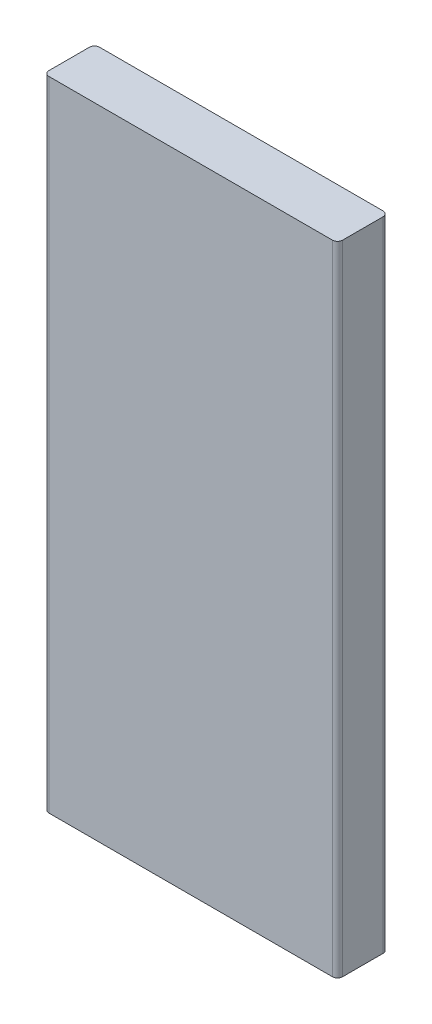
ISO-10303-21;
HEADER;
FILE_DESCRIPTION(('STEP AP214'),'2;1');
FILE_NAME('part.step','',(''),(''),'','','');
FILE_SCHEMA(('AUTOMOTIVE_DESIGN { 1 0 10303 214 1 1 1 1 }'));
ENDSEC;
DATA;
#1=APPLICATION_CONTEXT('core data for automotive mechanical design processes');
#2=APPLICATION_PROTOCOL_DEFINITION('international standard','automotive_design',2000,#1);
#3=PRODUCT_CONTEXT('',#1,'mechanical');
#4=PRODUCT('Part','Part','',(#3));
#5=PRODUCT_RELATED_PRODUCT_CATEGORY('part','',(#4));
#6=PRODUCT_DEFINITION_FORMATION('','',#4);
#7=PRODUCT_DEFINITION_CONTEXT('part definition',#1,'design');
#8=PRODUCT_DEFINITION('design','',#6,#7);
#9=PRODUCT_DEFINITION_SHAPE('','',#8);
#10=(LENGTH_UNIT() NAMED_UNIT(*) SI_UNIT(.MILLI.,.METRE.));
#11=(NAMED_UNIT(*) PLANE_ANGLE_UNIT() SI_UNIT($,.RADIAN.));
#12=(NAMED_UNIT(*) SI_UNIT($,.STERADIAN.) SOLID_ANGLE_UNIT());
#13=UNCERTAINTY_MEASURE_WITH_UNIT(LENGTH_MEASURE(1.E-05),#10,'distance_accuracy_value','');
#14=(GEOMETRIC_REPRESENTATION_CONTEXT(3) GLOBAL_UNCERTAINTY_ASSIGNED_CONTEXT((#13)) GLOBAL_UNIT_ASSIGNED_CONTEXT((#10,
#11,#12)) REPRESENTATION_CONTEXT('',''));
#15=CARTESIAN_POINT('',(0.,0.,0.));
#16=DIRECTION('',(0.,0.,1.));
#17=DIRECTION('',(1.,0.,0.));
#18=AXIS2_PLACEMENT_3D('',#15,#16,#17);
#19=CARTESIAN_POINT('',(-1.4,3.15,0.55));
#20=DIRECTION('',(0.,1.,0.));
#21=DIRECTION('',(1.,0.,0.));
#22=AXIS2_PLACEMENT_3D('',#19,#20,#21);
#23=CYLINDRICAL_SURFACE('',#22,0.05);
#24=CARTESIAN_POINT('',(-1.4,-3.15,0.55));
#25=DIRECTION('',(0.,1.,0.));
#26=DIRECTION('',(1.,0.,0.));
#27=AXIS2_PLACEMENT_3D('',#24,#25,#26);
#28=CIRCLE('',#27,0.05);
#29=CARTESIAN_POINT('',(-1.45,-3.15,0.55));
#30=VERTEX_POINT('',#29);
#31=CARTESIAN_POINT('',(-1.4,-3.15,0.6));
#32=VERTEX_POINT('',#31);
#33=EDGE_CURVE('E11',#30,#32,#28,.T.);
#34=ORIENTED_EDGE('',*,*,#33,.T.);
#35=DIRECTION('',(0.,-1.,0.));
#36=VECTOR('',#35,1.);
#37=CARTESIAN_POINT('',(-1.4,3.15,0.6));
#38=LINE('',#37,#36);
#39=CARTESIAN_POINT('',(-1.4,3.15,0.6));
#40=VERTEX_POINT('',#39);
#41=EDGE_CURVE('E24',#40,#32,#38,.T.);
#42=ORIENTED_EDGE('',*,*,#41,.F.);
#43=CARTESIAN_POINT('',(-1.4,3.15,0.55));
#44=DIRECTION('',(0.,-1.,0.));
#45=DIRECTION('',(1.,0.,0.));
#46=AXIS2_PLACEMENT_3D('',#43,#44,#45);
#47=CIRCLE('',#46,0.05);
#48=CARTESIAN_POINT('',(-1.45,3.15,0.55));
#49=VERTEX_POINT('',#48);
#50=EDGE_CURVE('E137',#40,#49,#47,.T.);
#51=ORIENTED_EDGE('',*,*,#50,.T.);
#52=DIRECTION('',(0.,-1.,0.));
#53=VECTOR('',#52,1.);
#54=CARTESIAN_POINT('',(-1.45,3.15,0.55));
#55=LINE('',#54,#53);
#56=EDGE_CURVE('E135',#49,#30,#55,.T.);
#57=ORIENTED_EDGE('',*,*,#56,.T.);
#58=EDGE_LOOP('',(#34,#42,#51,#57));
#59=FACE_BOUND('',#58,.T.);
#60=ADVANCED_FACE('F17',(#59),#23,.T.);
#61=CARTESIAN_POINT('',(-1.45,3.15,0.15));
#62=DIRECTION('',(-1.,0.,0.));
#63=DIRECTION('',(0.,0.,1.));
#64=AXIS2_PLACEMENT_3D('',#61,#62,#63);
#65=PLANE('',#64);
#66=DIRECTION('',(0.,0.,1.));
#67=VECTOR('',#66,1.);
#68=CARTESIAN_POINT('',(-1.45,-3.15,0.075));
#69=LINE('',#68,#67);
#70=CARTESIAN_POINT('',(-1.45,-3.15,0.15));
#71=VERTEX_POINT('',#70);
#72=EDGE_CURVE('E132',#71,#30,#69,.T.);
#73=ORIENTED_EDGE('',*,*,#72,.T.);
#74=ORIENTED_EDGE('',*,*,#56,.F.);
#75=DIRECTION('',(0.,0.,-1.));
#76=VECTOR('',#75,1.);
#77=CARTESIAN_POINT('',(-1.45,3.15,0.075));
#78=LINE('',#77,#76);
#79=CARTESIAN_POINT('',(-1.45,3.15,0.15));
#80=VERTEX_POINT('',#79);
#81=EDGE_CURVE('E130',#49,#80,#78,.T.);
#82=ORIENTED_EDGE('',*,*,#81,.T.);
#83=DIRECTION('',(0.,-1.,0.));
#84=VECTOR('',#83,1.);
#85=CARTESIAN_POINT('',(-1.45,3.15,0.15));
#86=LINE('',#85,#84);
#87=EDGE_CURVE('E127',#80,#71,#86,.T.);
#88=ORIENTED_EDGE('',*,*,#87,.T.);
#89=EDGE_LOOP('',(#73,#74,#82,#88));
#90=FACE_BOUND('',#89,.T.);
#91=ADVANCED_FACE('F143',(#90),#65,.T.);
#92=CARTESIAN_POINT('',(-1.4,3.15,0.15));
#93=DIRECTION('',(0.,1.,0.));
#94=DIRECTION('',(0.,0.,1.));
#95=AXIS2_PLACEMENT_3D('',#92,#93,#94);
#96=CYLINDRICAL_SURFACE('',#95,0.05);
#97=CARTESIAN_POINT('',(-1.4,-3.15,0.15));
#98=DIRECTION('',(0.,1.,0.));
#99=DIRECTION('',(0.,0.,1.));
#100=AXIS2_PLACEMENT_3D('',#97,#98,#99);
#101=CIRCLE('',#100,0.05);
#102=CARTESIAN_POINT('',(-1.4,-3.15,0.1));
#103=VERTEX_POINT('',#102);
#104=EDGE_CURVE('E124',#103,#71,#101,.T.);
#105=ORIENTED_EDGE('',*,*,#104,.T.);
#106=ORIENTED_EDGE('',*,*,#87,.F.);
#107=CARTESIAN_POINT('',(-1.4,3.15,0.15));
#108=DIRECTION('',(0.,-1.,0.));
#109=DIRECTION('',(0.,0.,1.));
#110=AXIS2_PLACEMENT_3D('',#107,#108,#109);
#111=CIRCLE('',#110,0.05);
#112=CARTESIAN_POINT('',(-1.4,3.15,0.1));
#113=VERTEX_POINT('',#112);
#114=EDGE_CURVE('E122',#80,#113,#111,.T.);
#115=ORIENTED_EDGE('',*,*,#114,.T.);
#116=DIRECTION('',(0.,-1.,0.));
#117=VECTOR('',#116,1.);
#118=CARTESIAN_POINT('',(-1.4,3.15,0.1));
#119=LINE('',#118,#117);
#120=EDGE_CURVE('E119',#113,#103,#119,.T.);
#121=ORIENTED_EDGE('',*,*,#120,.T.);
#122=EDGE_LOOP('',(#105,#106,#115,#121));
#123=FACE_BOUND('',#122,.T.);
#124=ADVANCED_FACE('F151',(#123),#96,.T.);
#125=CARTESIAN_POINT('',(1.4,3.15,0.15));
#126=DIRECTION('',(0.,1.,0.));
#127=DIRECTION('',(-1.,0.,0.));
#128=AXIS2_PLACEMENT_3D('',#125,#126,#127);
#129=CYLINDRICAL_SURFACE('',#128,0.0499999999999997);
#130=CARTESIAN_POINT('',(1.4,3.15,0.15));
#131=DIRECTION('',(0.,-1.,0.));
#132=DIRECTION('',(-1.,0.,0.));
#133=AXIS2_PLACEMENT_3D('',#130,#131,#132);
#134=CIRCLE('',#133,0.0499999999999997);
#135=CARTESIAN_POINT('',(1.4,3.15,0.1));
#136=VERTEX_POINT('',#135);
#137=CARTESIAN_POINT('',(1.45,3.15,0.15));
#138=VERTEX_POINT('',#137);
#139=EDGE_CURVE('E117',#136,#138,#134,.T.);
#140=ORIENTED_EDGE('',*,*,#139,.T.);
#141=DIRECTION('',(0.,-1.,0.));
#142=VECTOR('',#141,1.);
#143=CARTESIAN_POINT('',(1.45,3.15,0.15));
#144=LINE('',#143,#142);
#145=CARTESIAN_POINT('',(1.45,-3.15,0.15));
#146=VERTEX_POINT('',#145);
#147=EDGE_CURVE('E115',#138,#146,#144,.T.);
#148=ORIENTED_EDGE('',*,*,#147,.T.);
#149=CARTESIAN_POINT('',(1.4,-3.15,0.15));
#150=DIRECTION('',(0.,1.,0.));
#151=DIRECTION('',(-1.,0.,0.));
#152=AXIS2_PLACEMENT_3D('',#149,#150,#151);
#153=CIRCLE('',#152,0.0499999999999997);
#154=CARTESIAN_POINT('',(1.4,-3.15,0.1));
#155=VERTEX_POINT('',#154);
#156=EDGE_CURVE('E113',#146,#155,#153,.T.);
#157=ORIENTED_EDGE('',*,*,#156,.T.);
#158=DIRECTION('',(0.,-1.,0.));
#159=VECTOR('',#158,1.);
#160=CARTESIAN_POINT('',(1.4,3.15,0.1));
#161=LINE('',#160,#159);
#162=EDGE_CURVE('E110',#136,#155,#161,.T.);
#163=ORIENTED_EDGE('',*,*,#162,.F.);
#164=EDGE_LOOP('',(#140,#148,#157,#163));
#165=FACE_BOUND('',#164,.T.);
#166=ADVANCED_FACE('F163',(#165),#129,.T.);
#167=CARTESIAN_POINT('',(1.45,3.15,0.55));
#168=DIRECTION('',(1.,0.,0.));
#169=DIRECTION('',(0.,0.,-1.));
#170=AXIS2_PLACEMENT_3D('',#167,#168,#169);
#171=PLANE('',#170);
#172=DIRECTION('',(0.,0.,1.));
#173=VECTOR('',#172,1.);
#174=CARTESIAN_POINT('',(1.45,3.15,0.275));
#175=LINE('',#174,#173);
#176=CARTESIAN_POINT('',(1.45,3.15,0.55));
#177=VERTEX_POINT('',#176);
#178=EDGE_CURVE('E108',#138,#177,#175,.T.);
#179=ORIENTED_EDGE('',*,*,#178,.T.);
#180=DIRECTION('',(0.,-1.,0.));
#181=VECTOR('',#180,1.);
#182=CARTESIAN_POINT('',(1.45,3.15,0.55));
#183=LINE('',#182,#181);
#184=CARTESIAN_POINT('',(1.45,-3.15,0.55));
#185=VERTEX_POINT('',#184);
#186=EDGE_CURVE('E106',#177,#185,#183,.T.);
#187=ORIENTED_EDGE('',*,*,#186,.T.);
#188=DIRECTION('',(0.,0.,-1.));
#189=VECTOR('',#188,1.);
#190=CARTESIAN_POINT('',(1.45,-3.15,0.275));
#191=LINE('',#190,#189);
#192=EDGE_CURVE('E94',#185,#146,#191,.T.);
#193=ORIENTED_EDGE('',*,*,#192,.T.);
#194=ORIENTED_EDGE('',*,*,#147,.F.);
#195=EDGE_LOOP('',(#179,#187,#193,#194));
#196=FACE_BOUND('',#195,.T.);
#197=ADVANCED_FACE('F159',(#196),#171,.T.);
#198=CARTESIAN_POINT('',(1.4,3.15,0.55));
#199=DIRECTION('',(0.,1.,0.));
#200=DIRECTION('',(0.,0.,-1.));
#201=AXIS2_PLACEMENT_3D('',#198,#199,#200);
#202=CYLINDRICAL_SURFACE('',#201,0.05);
#203=CARTESIAN_POINT('',(1.4,3.15,0.55));
#204=DIRECTION('',(0.,-1.,0.));
#205=DIRECTION('',(0.,0.,-1.));
#206=AXIS2_PLACEMENT_3D('',#203,#204,#205);
#207=CIRCLE('',#206,0.05);
#208=CARTESIAN_POINT('',(1.4,3.15,0.6));
#209=VERTEX_POINT('',#208);
#210=EDGE_CURVE('E83',#177,#209,#207,.T.);
#211=ORIENTED_EDGE('',*,*,#210,.T.);
#212=DIRECTION('',(0.,1.,0.));
#213=VECTOR('',#212,1.);
#214=CARTESIAN_POINT('',(1.4,3.15,0.6));
#215=LINE('',#214,#213);
#216=CARTESIAN_POINT('',(1.4,-3.15,0.6));
#217=VERTEX_POINT('',#216);
#218=EDGE_CURVE('E77',#217,#209,#215,.T.);
#219=ORIENTED_EDGE('',*,*,#218,.F.);
#220=CARTESIAN_POINT('',(1.4,-3.15,0.55));
#221=DIRECTION('',(0.,1.,0.));
#222=DIRECTION('',(0.,0.,-1.));
#223=AXIS2_PLACEMENT_3D('',#220,#221,#222);
#224=CIRCLE('',#223,0.05);
#225=EDGE_CURVE('E81',#217,#185,#224,.T.);
#226=ORIENTED_EDGE('',*,*,#225,.T.);
#227=ORIENTED_EDGE('',*,*,#186,.F.);
#228=EDGE_LOOP('',(#211,#219,#226,#227));
#229=FACE_BOUND('',#228,.T.);
#230=ADVANCED_FACE('F79',(#229),#202,.T.);
#231=CARTESIAN_POINT('',(-1.55,-3.15,0.));
#232=DIRECTION('',(0.,-1.,0.));
#233=DIRECTION('',(1.,0.,0.));
#234=AXIS2_PLACEMENT_3D('',#231,#232,#233);
#235=PLANE('',#234);
#236=DIRECTION('',(1.,0.,0.));
#237=VECTOR('',#236,1.);
#238=CARTESIAN_POINT('',(-1.475,-3.15,0.6));
#239=LINE('',#238,#237);
#240=EDGE_CURVE('E91',#32,#217,#239,.T.);
#241=ORIENTED_EDGE('',*,*,#240,.F.);
#242=ORIENTED_EDGE('',*,*,#33,.F.);
#243=ORIENTED_EDGE('',*,*,#72,.F.);
#244=ORIENTED_EDGE('',*,*,#104,.F.);
#245=DIRECTION('',(-1.,0.,0.));
#246=VECTOR('',#245,1.);
#247=CARTESIAN_POINT('',(-0.0749999999999996,-3.15,0.1));
#248=LINE('',#247,#246);
#249=EDGE_CURVE('E97',#155,#103,#248,.T.);
#250=ORIENTED_EDGE('',*,*,#249,.F.);
#251=ORIENTED_EDGE('',*,*,#156,.F.);
#252=ORIENTED_EDGE('',*,*,#192,.F.);
#253=ORIENTED_EDGE('',*,*,#225,.F.);
#254=EDGE_LOOP('',(#241,#242,#243,#244,#250,#251,#252,#253));
#255=FACE_BOUND('',#254,.T.);
#256=ADVANCED_FACE('F90',(#255),#235,.T.);
#257=CARTESIAN_POINT('',(0.,0.,0.1));
#258=DIRECTION('',(0.,0.,1.));
#259=DIRECTION('',(1.,0.,0.));
#260=AXIS2_PLACEMENT_3D('',#257,#258,#259);
#261=PLANE('',#260);
#262=ORIENTED_EDGE('',*,*,#249,.T.);
#263=ORIENTED_EDGE('',*,*,#120,.F.);
#264=DIRECTION('',(1.,0.,0.));
#265=VECTOR('',#264,1.);
#266=CARTESIAN_POINT('',(1.475,3.15,0.1));
#267=LINE('',#266,#265);
#268=EDGE_CURVE('E100',#113,#136,#267,.T.);
#269=ORIENTED_EDGE('',*,*,#268,.T.);
#270=ORIENTED_EDGE('',*,*,#162,.T.);
#271=EDGE_LOOP('',(#262,#263,#269,#270));
#272=FACE_BOUND('',#271,.T.);
#273=ADVANCED_FACE('F153',(#272),#261,.F.);
#274=CARTESIAN_POINT('',(1.55,3.15,0.));
#275=DIRECTION('',(0.,1.,0.));
#276=DIRECTION('',(-1.,0.,0.));
#277=AXIS2_PLACEMENT_3D('',#274,#275,#276);
#278=PLANE('',#277);
#279=DIRECTION('',(-1.,0.,0.));
#280=VECTOR('',#279,1.);
#281=CARTESIAN_POINT('',(0.0750000000000002,3.15,0.6));
#282=LINE('',#281,#280);
#283=EDGE_CURVE('E161',#209,#40,#282,.T.);
#284=ORIENTED_EDGE('',*,*,#283,.F.);
#285=ORIENTED_EDGE('',*,*,#210,.F.);
#286=ORIENTED_EDGE('',*,*,#178,.F.);
#287=ORIENTED_EDGE('',*,*,#139,.F.);
#288=ORIENTED_EDGE('',*,*,#268,.F.);
#289=ORIENTED_EDGE('',*,*,#114,.F.);
#290=ORIENTED_EDGE('',*,*,#81,.F.);
#291=ORIENTED_EDGE('',*,*,#50,.F.);
#292=EDGE_LOOP('',(#284,#285,#286,#287,#288,#289,#290,#291));
#293=FACE_BOUND('',#292,.T.);
#294=ADVANCED_FACE('F146',(#293),#278,.T.);
#295=CARTESIAN_POINT('',(0.,0.,0.6));
#296=DIRECTION('',(0.,0.,-1.));
#297=DIRECTION('',(-1.,0.,0.));
#298=AXIS2_PLACEMENT_3D('',#295,#296,#297);
#299=PLANE('',#298);
#300=ORIENTED_EDGE('',*,*,#240,.T.);
#301=ORIENTED_EDGE('',*,*,#218,.T.);
#302=ORIENTED_EDGE('',*,*,#283,.T.);
#303=ORIENTED_EDGE('',*,*,#41,.T.);
#304=EDGE_LOOP('',(#300,#301,#302,#303));
#305=FACE_BOUND('',#304,.T.);
#306=ADVANCED_FACE('F96',(#305),#299,.F.);
#307=CLOSED_SHELL('',(#60,#91,#124,#166,#197,#230,#256,#273,#294,#306));
#308=MANIFOLD_SOLID_BREP('B1',#307);
#309=ADVANCED_BREP_SHAPE_REPRESENTATION('',(#18,#308),#14);
#310=SHAPE_DEFINITION_REPRESENTATION(#9,#309);
ENDSEC;
END-ISO-10303-21;
